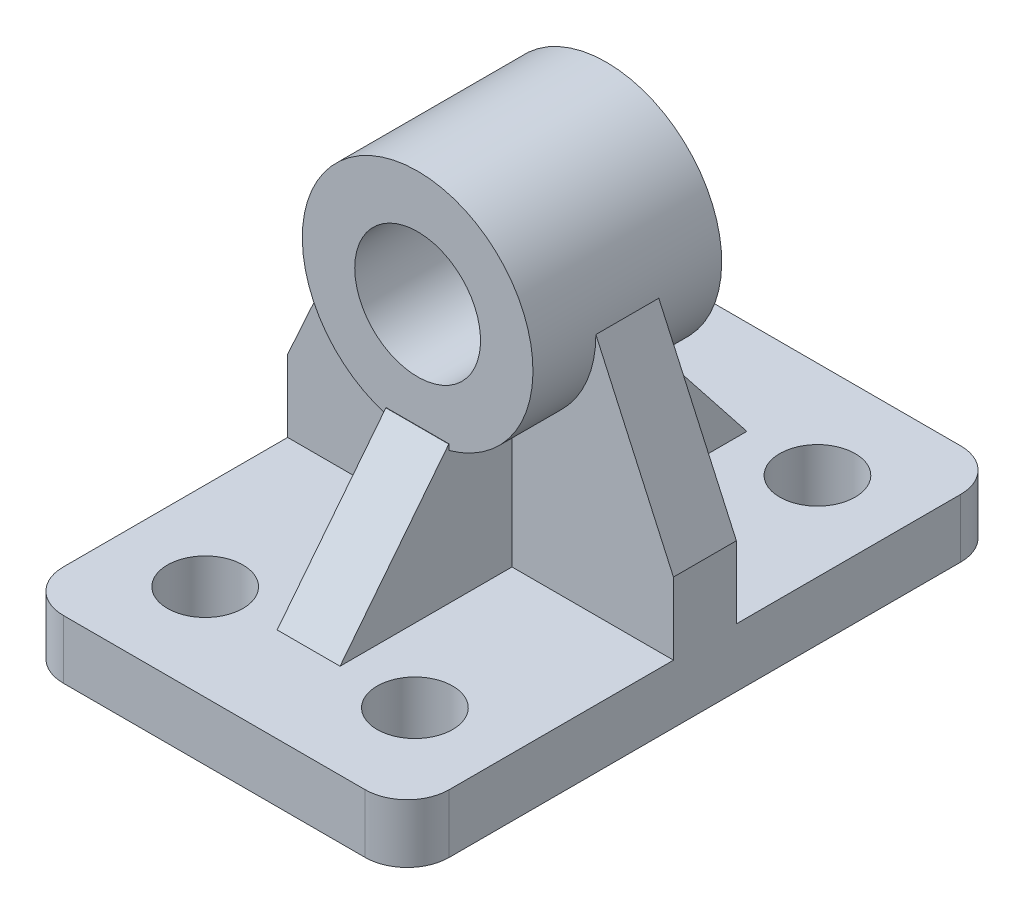
ISO-10303-21;
HEADER;
FILE_DESCRIPTION(('STEP AP214'),'2;1');
FILE_NAME('part.step','',(''),(''),'','','');
FILE_SCHEMA(('AUTOMOTIVE_DESIGN { 1 0 10303 214 1 1 1 1 }'));
ENDSEC;
DATA;
#1=APPLICATION_CONTEXT('core data for automotive mechanical design processes');
#2=APPLICATION_PROTOCOL_DEFINITION('international standard','automotive_design',2000,#1);
#3=PRODUCT_CONTEXT('',#1,'mechanical');
#4=PRODUCT('Part','Part','',(#3));
#5=PRODUCT_RELATED_PRODUCT_CATEGORY('part','',(#4));
#6=PRODUCT_DEFINITION_FORMATION('','',#4);
#7=PRODUCT_DEFINITION_CONTEXT('part definition',#1,'design');
#8=PRODUCT_DEFINITION('design','',#6,#7);
#9=PRODUCT_DEFINITION_SHAPE('','',#8);
#10=(LENGTH_UNIT() NAMED_UNIT(*) SI_UNIT(.MILLI.,.METRE.));
#11=(NAMED_UNIT(*) PLANE_ANGLE_UNIT() SI_UNIT($,.RADIAN.));
#12=(NAMED_UNIT(*) SI_UNIT($,.STERADIAN.) SOLID_ANGLE_UNIT());
#13=UNCERTAINTY_MEASURE_WITH_UNIT(LENGTH_MEASURE(1.E-05),#10,'distance_accuracy_value','');
#14=(GEOMETRIC_REPRESENTATION_CONTEXT(3) GLOBAL_UNCERTAINTY_ASSIGNED_CONTEXT((#13)) GLOBAL_UNIT_ASSIGNED_CONTEXT((#10,
#11,#12)) REPRESENTATION_CONTEXT('',''));
#15=CARTESIAN_POINT('',(0.,0.,0.));
#16=DIRECTION('',(0.,0.,1.));
#17=DIRECTION('',(1.,0.,0.));
#18=AXIS2_PLACEMENT_3D('',#15,#16,#17);
#19=CARTESIAN_POINT('',(0.,0.,-63.5));
#20=DIRECTION('',(0.,0.,1.));
#21=DIRECTION('',(1.,0.,0.));
#22=AXIS2_PLACEMENT_3D('',#19,#20,#21);
#23=PLANE('',#22);
#24=CARTESIAN_POINT('',(189.801246264602,58.,-63.5));
#25=DIRECTION('',(0.,0.,1.));
#26=DIRECTION('',(1.,0.,0.));
#27=AXIS2_PLACEMENT_3D('',#24,#25,#26);
#28=CIRCLE('',#27,27.5);
#29=CARTESIAN_POINT('',(197.301246264602,31.5424868893541,-63.5));
#30=VERTEX_POINT('',#29);
#31=CARTESIAN_POINT('',(217.301246264602,58.,-63.5));
#32=VERTEX_POINT('',#31);
#33=EDGE_CURVE('E289',#30,#32,#28,.T.);
#34=ORIENTED_EDGE('',*,*,#33,.F.);
#35=DIRECTION('',(0.,-1.,0.));
#36=VECTOR('',#35,1.);
#37=CARTESIAN_POINT('',(197.301246264602,0.,-63.5));
#38=LINE('',#37,#36);
#39=CARTESIAN_POINT('',(197.301246264602,0.,-63.5));
#40=VERTEX_POINT('',#39);
#41=EDGE_CURVE('E234',#30,#40,#38,.T.);
#42=ORIENTED_EDGE('',*,*,#41,.T.);
#43=DIRECTION('',(1.,0.,0.));
#44=VECTOR('',#43,1.);
#45=CARTESIAN_POINT('',(0.,0.,-63.5));
#46=LINE('',#45,#44);
#47=CARTESIAN_POINT('',(235.801246264602,0.,-63.5));
#48=VERTEX_POINT('',#47);
#49=EDGE_CURVE('E232',#40,#48,#46,.T.);
#50=ORIENTED_EDGE('',*,*,#49,.T.);
#51=DIRECTION('',(0.,1.,0.));
#52=VECTOR('',#51,1.);
#53=CARTESIAN_POINT('',(235.801246264602,0.,-63.5));
#54=LINE('',#53,#52);
#55=CARTESIAN_POINT('',(235.801246264602,17.1644901601247,-63.5));
#56=VERTEX_POINT('',#55);
#57=EDGE_CURVE('E298',#48,#56,#54,.T.);
#58=ORIENTED_EDGE('',*,*,#57,.T.);
#59=DIRECTION('',(-0.412663930755312,0.910883351617305,0.));
#60=VECTOR('',#59,1.);
#61=CARTESIAN_POINT('',(202.098231647013,91.5579920547202,-63.5));
#62=LINE('',#61,#60);
#63=EDGE_CURVE('E300',#56,#32,#62,.T.);
#64=ORIENTED_EDGE('',*,*,#63,.T.);
#65=EDGE_LOOP('',(#34,#42,#50,#58,#64));
#66=FACE_BOUND('',#65,.T.);
#67=ADVANCED_FACE('F41',(#66),#23,.T.);
#68=CARTESIAN_POINT('',(153.801246264602,0.,-132.));
#69=DIRECTION('',(0.,-1.,0.));
#70=DIRECTION('',(0.,0.,-1.));
#71=AXIS2_PLACEMENT_3D('',#68,#69,#70);
#72=PLANE('',#71);
#73=CARTESIAN_POINT('',(214.801246264602,0.,-118.829727622216));
#74=DIRECTION('',(0.,1.,0.));
#75=DIRECTION('',(0.,0.,1.));
#76=AXIS2_PLACEMENT_3D('',#73,#74,#75);
#77=CIRCLE('',#76,9.00000000000001);
#78=CARTESIAN_POINT('',(214.801246264602,0.,-109.829727622216));
#79=VERTEX_POINT('',#78);
#80=EDGE_CURVE('E335',#79,#79,#77,.T.);
#81=ORIENTED_EDGE('',*,*,#80,.F.);
#82=EDGE_LOOP('',(#81));
#83=FACE_BOUND('',#82,.T.);
#84=CARTESIAN_POINT('',(164.801246264602,0.,-118.829727622216));
#85=DIRECTION('',(0.,1.,0.));
#86=DIRECTION('',(0.,0.,1.));
#87=AXIS2_PLACEMENT_3D('',#84,#85,#86);
#88=CIRCLE('',#87,9.00000000000001);
#89=CARTESIAN_POINT('',(164.801246264602,0.,-109.829727622216));
#90=VERTEX_POINT('',#89);
#91=EDGE_CURVE('E331',#90,#90,#88,.T.);
#92=ORIENTED_EDGE('',*,*,#91,.F.);
#93=EDGE_LOOP('',(#92));
#94=FACE_BOUND('',#93,.T.);
#95=DIRECTION('',(0.,0.,1.));
#96=VECTOR('',#95,1.);
#97=CARTESIAN_POINT('',(182.301246264602,0.,-78.5));
#98=LINE('',#97,#96);
#99=CARTESIAN_POINT('',(182.301246264602,0.,-119.5));
#100=VERTEX_POINT('',#99);
#101=CARTESIAN_POINT('',(182.301246264602,0.,-78.5));
#102=VERTEX_POINT('',#101);
#103=EDGE_CURVE('E64',#100,#102,#98,.T.);
#104=ORIENTED_EDGE('',*,*,#103,.F.);
#105=DIRECTION('',(1.,0.,0.));
#106=VECTOR('',#105,1.);
#107=CARTESIAN_POINT('',(182.301246264602,0.,-119.5));
#108=LINE('',#107,#106);
#109=CARTESIAN_POINT('',(197.301246264602,0.,-119.5));
#110=VERTEX_POINT('',#109);
#111=EDGE_CURVE('E258',#100,#110,#108,.T.);
#112=ORIENTED_EDGE('',*,*,#111,.T.);
#113=DIRECTION('',(0.,0.,1.));
#114=VECTOR('',#113,1.);
#115=CARTESIAN_POINT('',(197.301246264602,0.,-119.5));
#116=LINE('',#115,#114);
#117=CARTESIAN_POINT('',(197.301246264602,0.,-78.5));
#118=VERTEX_POINT('',#117);
#119=EDGE_CURVE('E252',#110,#118,#116,.T.);
#120=ORIENTED_EDGE('',*,*,#119,.T.);
#121=DIRECTION('',(1.,0.,0.));
#122=VECTOR('',#121,1.);
#123=CARTESIAN_POINT('',(0.,0.,-78.5));
#124=LINE('',#123,#122);
#125=CARTESIAN_POINT('',(235.801246264602,0.,-78.5));
#126=VERTEX_POINT('',#125);
#127=EDGE_CURVE('E313',#118,#126,#124,.T.);
#128=ORIENTED_EDGE('',*,*,#127,.T.);
#129=DIRECTION('',(0.,0.,-1.));
#130=VECTOR('',#129,1.);
#131=CARTESIAN_POINT('',(235.801246264602,0.,-10.));
#132=LINE('',#131,#130);
#133=CARTESIAN_POINT('',(235.801246264602,0.,-132.));
#134=VERTEX_POINT('',#133);
#135=EDGE_CURVE('E396',#126,#134,#132,.T.);
#136=ORIENTED_EDGE('',*,*,#135,.T.);
#137=CARTESIAN_POINT('',(225.801246264602,0.,-132.));
#138=DIRECTION('',(0.,1.,0.));
#139=DIRECTION('',(0.,0.,-1.));
#140=AXIS2_PLACEMENT_3D('',#137,#138,#139);
#141=CIRCLE('',#140,10.);
#142=CARTESIAN_POINT('',(225.801246264602,0.,-142.));
#143=VERTEX_POINT('',#142);
#144=EDGE_CURVE('E399',#134,#143,#141,.T.);
#145=ORIENTED_EDGE('',*,*,#144,.T.);
#146=DIRECTION('',(-1.,0.,0.));
#147=VECTOR('',#146,1.);
#148=CARTESIAN_POINT('',(225.801246264602,0.,-142.));
#149=LINE('',#148,#147);
#150=CARTESIAN_POINT('',(153.801246264602,0.,-142.));
#151=VERTEX_POINT('',#150);
#152=EDGE_CURVE('E360',#143,#151,#149,.T.);
#153=ORIENTED_EDGE('',*,*,#152,.T.);
#154=CARTESIAN_POINT('',(153.801246264602,0.,-132.));
#155=DIRECTION('',(0.,1.,0.));
#156=DIRECTION('',(0.,0.,-1.));
#157=AXIS2_PLACEMENT_3D('',#154,#155,#156);
#158=CIRCLE('',#157,9.99999999999999);
#159=CARTESIAN_POINT('',(143.801246264602,0.,-132.));
#160=VERTEX_POINT('',#159);
#161=EDGE_CURVE('E353',#151,#160,#158,.T.);
#162=ORIENTED_EDGE('',*,*,#161,.T.);
#163=DIRECTION('',(0.,0.,1.));
#164=VECTOR('',#163,1.);
#165=CARTESIAN_POINT('',(143.801246264602,0.,-132.));
#166=LINE('',#165,#164);
#167=CARTESIAN_POINT('',(143.801246264602,0.,-78.5));
#168=VERTEX_POINT('',#167);
#169=EDGE_CURVE('E385',#160,#168,#166,.T.);
#170=ORIENTED_EDGE('',*,*,#169,.T.);
#171=EDGE_CURVE('E314',#168,#102,#124,.T.);
#172=ORIENTED_EDGE('',*,*,#171,.T.);
#173=EDGE_LOOP('',(#104,#112,#120,#128,#136,#145,#153,#162,#170,#172));
#174=FACE_BOUND('',#173,.T.);
#175=ADVANCED_FACE('F497',(#83,#94,#174),#72,.F.);
#176=CARTESIAN_POINT('',(0.,0.,-78.5));
#177=DIRECTION('',(0.,0.,1.));
#178=DIRECTION('',(1.,0.,0.));
#179=AXIS2_PLACEMENT_3D('',#176,#177,#178);
#180=PLANE('',#179);
#181=DIRECTION('',(0.,1.,0.));
#182=VECTOR('',#181,1.);
#183=CARTESIAN_POINT('',(182.301246264602,0.,-78.5));
#184=LINE('',#183,#182);
#185=CARTESIAN_POINT('',(182.301246264602,31.5424868893541,-78.5));
#186=VERTEX_POINT('',#185);
#187=EDGE_CURVE('E270',#102,#186,#184,.T.);
#188=ORIENTED_EDGE('',*,*,#187,.F.);
#189=ORIENTED_EDGE('',*,*,#171,.F.);
#190=DIRECTION('',(0.,1.,0.));
#191=VECTOR('',#190,1.);
#192=CARTESIAN_POINT('',(143.801246264602,0.,-78.5));
#193=LINE('',#192,#191);
#194=CARTESIAN_POINT('',(143.801246264602,17.1644901601247,-78.5));
#195=VERTEX_POINT('',#194);
#196=EDGE_CURVE('E310',#168,#195,#193,.T.);
#197=ORIENTED_EDGE('',*,*,#196,.T.);
#198=DIRECTION('',(0.412663930755312,0.910883351617305,0.));
#199=VECTOR('',#198,1.);
#200=CARTESIAN_POINT('',(112.861175529862,-51.1302970255465,-78.5));
#201=LINE('',#200,#199);
#202=CARTESIAN_POINT('',(162.301246264602,58.,-78.5));
#203=VERTEX_POINT('',#202);
#204=EDGE_CURVE('E307',#195,#203,#201,.T.);
#205=ORIENTED_EDGE('',*,*,#204,.T.);
#206=CARTESIAN_POINT('',(189.801246264602,58.,-78.5));
#207=DIRECTION('',(0.,0.,1.));
#208=DIRECTION('',(1.,0.,0.));
#209=AXIS2_PLACEMENT_3D('',#206,#207,#208);
#210=CIRCLE('',#209,27.5);
#211=EDGE_CURVE('E304',#203,#186,#210,.T.);
#212=ORIENTED_EDGE('',*,*,#211,.T.);
#213=EDGE_LOOP('',(#188,#189,#197,#205,#212));
#214=FACE_BOUND('',#213,.T.);
#215=ADVANCED_FACE('F495',(#214),#180,.F.);
#216=CARTESIAN_POINT('',(189.801246264602,58.,-48.5));
#217=DIRECTION('',(0.,0.,-1.));
#218=DIRECTION('',(-1.,0.,0.));
#219=AXIS2_PLACEMENT_3D('',#216,#217,#218);
#220=CYLINDRICAL_SURFACE('',#219,27.5);
#221=CARTESIAN_POINT('',(162.301246264602,58.,-63.5));
#222=VERTEX_POINT('',#221);
#223=CARTESIAN_POINT('',(182.301246264602,31.5424868893541,-63.5));
#224=VERTEX_POINT('',#223);
#225=EDGE_CURVE('E285',#222,#224,#28,.T.);
#226=ORIENTED_EDGE('',*,*,#225,.T.);
#227=DIRECTION('',(0.,0.,-1.));
#228=VECTOR('',#227,1.);
#229=CARTESIAN_POINT('',(182.301246264602,31.5424868893541,-48.5));
#230=LINE('',#229,#228);
#231=CARTESIAN_POINT('',(182.301246264602,31.5424868893541,-48.5));
#232=VERTEX_POINT('',#231);
#233=EDGE_CURVE('E243',#224,#232,#230,.F.);
#234=ORIENTED_EDGE('',*,*,#233,.T.);
#235=CARTESIAN_POINT('',(189.801246264602,58.,-48.5));
#236=DIRECTION('',(0.,0.,1.));
#237=DIRECTION('',(1.,0.,0.));
#238=AXIS2_PLACEMENT_3D('',#235,#236,#237);
#239=CIRCLE('',#238,27.5);
#240=CARTESIAN_POINT('',(197.301246264602,31.5424868893541,-48.5));
#241=VERTEX_POINT('',#240);
#242=EDGE_CURVE('E281',#241,#232,#239,.T.);
#243=ORIENTED_EDGE('',*,*,#242,.F.);
#244=DIRECTION('',(0.,0.,-1.));
#245=VECTOR('',#244,1.);
#246=CARTESIAN_POINT('',(197.301246264602,31.5424868893541,-48.5));
#247=LINE('',#246,#245);
#248=EDGE_CURVE('E56',#30,#241,#247,.F.);
#249=ORIENTED_EDGE('',*,*,#248,.F.);
#250=ORIENTED_EDGE('',*,*,#33,.T.);
#251=DIRECTION('',(0.,0.,-1.));
#252=VECTOR('',#251,1.);
#253=CARTESIAN_POINT('',(217.301246264602,58.,-63.5));
#254=LINE('',#253,#252);
#255=CARTESIAN_POINT('',(217.301246264602,58.,-78.5));
#256=VERTEX_POINT('',#255);
#257=EDGE_CURVE('E303',#32,#256,#254,.T.);
#258=ORIENTED_EDGE('',*,*,#257,.T.);
#259=CARTESIAN_POINT('',(197.301246264602,31.5424868893541,-78.5));
#260=VERTEX_POINT('',#259);
#261=EDGE_CURVE('E284',#260,#256,#210,.T.);
#262=ORIENTED_EDGE('',*,*,#261,.F.);
#263=DIRECTION('',(0.,0.,-1.));
#264=VECTOR('',#263,1.);
#265=CARTESIAN_POINT('',(197.301246264602,31.5424868893541,-48.5));
#266=LINE('',#265,#264);
#267=CARTESIAN_POINT('',(197.301246264602,31.5424868893541,-93.5));
#268=VERTEX_POINT('',#267);
#269=EDGE_CURVE('E260',#260,#268,#266,.T.);
#270=ORIENTED_EDGE('',*,*,#269,.T.);
#271=CARTESIAN_POINT('',(189.801246264602,58.,-93.5));
#272=DIRECTION('',(0.,0.,-1.));
#273=DIRECTION('',(-1.,0.,0.));
#274=AXIS2_PLACEMENT_3D('',#271,#272,#273);
#275=CIRCLE('',#274,27.5);
#276=CARTESIAN_POINT('',(182.301246264602,31.5424868893541,-93.5));
#277=VERTEX_POINT('',#276);
#278=EDGE_CURVE('E276',#277,#268,#275,.T.);
#279=ORIENTED_EDGE('',*,*,#278,.F.);
#280=DIRECTION('',(0.,0.,-1.));
#281=VECTOR('',#280,1.);
#282=CARTESIAN_POINT('',(182.301246264602,31.5424868893541,-48.5));
#283=LINE('',#282,#281);
#284=EDGE_CURVE('E267',#186,#277,#283,.T.);
#285=ORIENTED_EDGE('',*,*,#284,.F.);
#286=ORIENTED_EDGE('',*,*,#211,.F.);
#287=DIRECTION('',(0.,0.,-1.));
#288=VECTOR('',#287,1.);
#289=CARTESIAN_POINT('',(162.301246264602,58.,-63.5));
#290=LINE('',#289,#288);
#291=EDGE_CURVE('E328',#222,#203,#290,.T.);
#292=ORIENTED_EDGE('',*,*,#291,.F.);
#293=EDGE_LOOP('',(#226,#234,#243,#249,#250,#258,#262,#270,#279,#285,#286,#292));
#294=FACE_BOUND('',#293,.T.);
#295=ADVANCED_FACE('F439',(#294),#220,.T.);
#296=CARTESIAN_POINT('',(189.801246264602,58.,-93.5));
#297=DIRECTION('',(0.,0.,-1.));
#298=DIRECTION('',(-1.,0.,0.));
#299=AXIS2_PLACEMENT_3D('',#296,#297,#298);
#300=PLANE('',#299);
#301=CARTESIAN_POINT('',(189.801246264602,58.,-93.5));
#302=DIRECTION('',(0.,0.,-1.));
#303=DIRECTION('',(-1.,0.,0.));
#304=AXIS2_PLACEMENT_3D('',#301,#302,#303);
#305=CIRCLE('',#304,15.);
#306=CARTESIAN_POINT('',(174.801246264602,58.,-93.5));
#307=VERTEX_POINT('',#306);
#308=EDGE_CURVE('E273',#307,#307,#305,.T.);
#309=ORIENTED_EDGE('',*,*,#308,.F.);
#310=EDGE_LOOP('',(#309));
#311=FACE_BOUND('',#310,.T.);
#312=DIRECTION('',(1.,0.,0.));
#313=VECTOR('',#312,1.);
#314=CARTESIAN_POINT('',(182.301246264602,32.9050889007348,-93.5));
#315=LINE('',#314,#313);
#316=CARTESIAN_POINT('',(182.301246264602,32.9050889007348,-93.5));
#317=VERTEX_POINT('',#316);
#318=CARTESIAN_POINT('',(197.301246264602,32.9050889007348,-93.5));
#319=VERTEX_POINT('',#318);
#320=EDGE_CURVE('E254',#317,#319,#315,.T.);
#321=ORIENTED_EDGE('',*,*,#320,.F.);
#322=DIRECTION('',(0.,-1.,0.));
#323=VECTOR('',#322,1.);
#324=CARTESIAN_POINT('',(182.301246264602,58.,-93.5));
#325=LINE('',#324,#323);
#326=EDGE_CURVE('E424',#317,#277,#325,.T.);
#327=ORIENTED_EDGE('',*,*,#326,.T.);
#328=ORIENTED_EDGE('',*,*,#278,.T.);
#329=DIRECTION('',(0.,-1.,0.));
#330=VECTOR('',#329,1.);
#331=CARTESIAN_POINT('',(197.301246264602,58.,-93.5));
#332=LINE('',#331,#330);
#333=EDGE_CURVE('E406',#319,#268,#332,.T.);
#334=ORIENTED_EDGE('',*,*,#333,.F.);
#335=EDGE_LOOP('',(#321,#327,#328,#334));
#336=FACE_BOUND('',#335,.T.);
#337=ADVANCED_FACE('F535',(#311,#336),#300,.T.);
#338=CARTESIAN_POINT('',(164.801246264602,0.,-22.8450203924491));
#339=DIRECTION('',(0.,1.,0.));
#340=DIRECTION('',(0.,0.,1.));
#341=AXIS2_PLACEMENT_3D('',#338,#339,#340);
#342=CIRCLE('',#341,9.00000000000001);
#343=CARTESIAN_POINT('',(164.801246264602,0.,-13.8450203924491));
#344=VERTEX_POINT('',#343);
#345=EDGE_CURVE('E347',#344,#344,#342,.T.);
#346=ORIENTED_EDGE('',*,*,#345,.F.);
#347=EDGE_LOOP('',(#346));
#348=FACE_BOUND('',#347,.T.);
#349=CARTESIAN_POINT('',(214.801246264602,0.,-22.8450203924491));
#350=DIRECTION('',(0.,1.,0.));
#351=DIRECTION('',(0.,0.,1.));
#352=AXIS2_PLACEMENT_3D('',#349,#350,#351);
#353=CIRCLE('',#352,9.00000000000001);
#354=CARTESIAN_POINT('',(214.801246264602,0.,-13.8450203924491));
#355=VERTEX_POINT('',#354);
#356=EDGE_CURVE('E341',#355,#355,#353,.T.);
#357=ORIENTED_EDGE('',*,*,#356,.F.);
#358=EDGE_LOOP('',(#357));
#359=FACE_BOUND('',#358,.T.);
#360=DIRECTION('',(1.,0.,0.));
#361=VECTOR('',#360,1.);
#362=CARTESIAN_POINT('',(182.301246264602,0.,-22.5));
#363=LINE('',#362,#361);
#364=CARTESIAN_POINT('',(182.301246264602,0.,-22.5));
#365=VERTEX_POINT('',#364);
#366=CARTESIAN_POINT('',(197.301246264602,0.,-22.5));
#367=VERTEX_POINT('',#366);
#368=EDGE_CURVE('E209',#365,#367,#363,.T.);
#369=ORIENTED_EDGE('',*,*,#368,.F.);
#370=DIRECTION('',(0.,0.,-1.));
#371=VECTOR('',#370,1.);
#372=CARTESIAN_POINT('',(182.301246264602,0.,-22.5));
#373=LINE('',#372,#371);
#374=CARTESIAN_POINT('',(182.301246264602,0.,-63.5));
#375=VERTEX_POINT('',#374);
#376=EDGE_CURVE('E227',#365,#375,#373,.T.);
#377=ORIENTED_EDGE('',*,*,#376,.T.);
#378=CARTESIAN_POINT('',(143.801246264602,0.,-63.5));
#379=VERTEX_POINT('',#378);
#380=EDGE_CURVE('E295',#379,#375,#46,.T.);
#381=ORIENTED_EDGE('',*,*,#380,.F.);
#382=CARTESIAN_POINT('',(143.801246264602,0.,-10.));
#383=VERTEX_POINT('',#382);
#384=EDGE_CURVE('E384',#379,#383,#166,.T.);
#385=ORIENTED_EDGE('',*,*,#384,.T.);
#386=CARTESIAN_POINT('',(153.801246264602,0.,-10.));
#387=DIRECTION('',(0.,1.,0.));
#388=DIRECTION('',(0.,0.,-1.));
#389=AXIS2_PLACEMENT_3D('',#386,#387,#388);
#390=CIRCLE('',#389,10.);
#391=CARTESIAN_POINT('',(153.801246264602,0.,0.));
#392=VERTEX_POINT('',#391);
#393=EDGE_CURVE('E387',#383,#392,#390,.T.);
#394=ORIENTED_EDGE('',*,*,#393,.T.);
#395=DIRECTION('',(1.,0.,0.));
#396=VECTOR('',#395,1.);
#397=CARTESIAN_POINT('',(153.801246264602,0.,0.));
#398=LINE('',#397,#396);
#399=CARTESIAN_POINT('',(225.801246264602,0.,0.));
#400=VERTEX_POINT('',#399);
#401=EDGE_CURVE('E390',#392,#400,#398,.T.);
#402=ORIENTED_EDGE('',*,*,#401,.T.);
#403=CARTESIAN_POINT('',(225.801246264602,0.,-10.));
#404=DIRECTION('',(0.,1.,0.));
#405=DIRECTION('',(0.,0.,-1.));
#406=AXIS2_PLACEMENT_3D('',#403,#404,#405);
#407=CIRCLE('',#406,10.);
#408=CARTESIAN_POINT('',(235.801246264602,0.,-10.));
#409=VERTEX_POINT('',#408);
#410=EDGE_CURVE('E393',#400,#409,#407,.T.);
#411=ORIENTED_EDGE('',*,*,#410,.T.);
#412=EDGE_CURVE('E397',#409,#48,#132,.T.);
#413=ORIENTED_EDGE('',*,*,#412,.T.);
#414=ORIENTED_EDGE('',*,*,#49,.F.);
#415=DIRECTION('',(0.,0.,1.));
#416=VECTOR('',#415,1.);
#417=CARTESIAN_POINT('',(197.301246264602,0.,-65.3950820099108));
#418=LINE('',#417,#416);
#419=EDGE_CURVE('E222',#40,#367,#418,.T.);
#420=ORIENTED_EDGE('',*,*,#419,.T.);
#421=EDGE_LOOP('',(#369,#377,#381,#385,#394,#402,#411,#413,#414,#420));
#422=FACE_BOUND('',#421,.T.);
#423=ADVANCED_FACE('F230',(#348,#359,#422),#72,.F.);
#424=CARTESIAN_POINT('',(153.801246264602,-14.,-132.));
#425=DIRECTION('',(0.,1.,0.));
#426=DIRECTION('',(0.,0.,1.));
#427=AXIS2_PLACEMENT_3D('',#424,#425,#426);
#428=CYLINDRICAL_SURFACE('',#427,9.99999999999999);
#429=ORIENTED_EDGE('',*,*,#161,.F.);
#430=DIRECTION('',(0.,1.,0.));
#431=VECTOR('',#430,1.);
#432=CARTESIAN_POINT('',(153.801246264602,-14.,-142.));
#433=LINE('',#432,#431);
#434=CARTESIAN_POINT('',(153.801246264602,-14.,-142.));
#435=VERTEX_POINT('',#434);
#436=EDGE_CURVE('E404',#435,#151,#433,.T.);
#437=ORIENTED_EDGE('',*,*,#436,.F.);
#438=CARTESIAN_POINT('',(153.801246264602,-14.,-132.));
#439=DIRECTION('',(0.,1.,0.));
#440=DIRECTION('',(0.,0.,-1.));
#441=AXIS2_PLACEMENT_3D('',#438,#439,#440);
#442=CIRCLE('',#441,9.99999999999999);
#443=CARTESIAN_POINT('',(143.801246264602,-14.,-132.));
#444=VERTEX_POINT('',#443);
#445=EDGE_CURVE('E356',#435,#444,#442,.T.);
#446=ORIENTED_EDGE('',*,*,#445,.T.);
#447=DIRECTION('',(0.,1.,0.));
#448=VECTOR('',#447,1.);
#449=CARTESIAN_POINT('',(143.801246264602,-14.,-132.));
#450=LINE('',#449,#448);
#451=EDGE_CURVE('E381',#444,#160,#450,.T.);
#452=ORIENTED_EDGE('',*,*,#451,.T.);
#453=EDGE_LOOP('',(#429,#437,#446,#452));
#454=FACE_BOUND('',#453,.T.);
#455=ADVANCED_FACE('F43',(#454),#428,.T.);
#456=CARTESIAN_POINT('',(225.801246264602,-14.,-142.));
#457=DIRECTION('',(0.,0.,-1.));
#458=DIRECTION('',(-1.,0.,0.));
#459=AXIS2_PLACEMENT_3D('',#456,#457,#458);
#460=PLANE('',#459);
#461=ORIENTED_EDGE('',*,*,#152,.F.);
#462=DIRECTION('',(0.,1.,0.));
#463=VECTOR('',#462,1.);
#464=CARTESIAN_POINT('',(225.801246264602,-14.,-142.));
#465=LINE('',#464,#463);
#466=CARTESIAN_POINT('',(225.801246264602,-14.,-142.));
#467=VERTEX_POINT('',#466);
#468=EDGE_CURVE('E407',#467,#143,#465,.T.);
#469=ORIENTED_EDGE('',*,*,#468,.F.);
#470=DIRECTION('',(-1.,0.,0.));
#471=VECTOR('',#470,1.);
#472=CARTESIAN_POINT('',(225.801246264602,-14.,-142.));
#473=LINE('',#472,#471);
#474=EDGE_CURVE('E378',#467,#435,#473,.T.);
#475=ORIENTED_EDGE('',*,*,#474,.T.);
#476=ORIENTED_EDGE('',*,*,#436,.T.);
#477=EDGE_LOOP('',(#461,#469,#475,#476));
#478=FACE_BOUND('',#477,.T.);
#479=ADVANCED_FACE('F837',(#478),#460,.T.);
#480=CARTESIAN_POINT('',(225.801246264602,-14.,-132.));
#481=DIRECTION('',(0.,1.,0.));
#482=DIRECTION('',(0.,0.,1.));
#483=AXIS2_PLACEMENT_3D('',#480,#481,#482);
#484=CYLINDRICAL_SURFACE('',#483,10.);
#485=ORIENTED_EDGE('',*,*,#144,.F.);
#486=DIRECTION('',(0.,1.,0.));
#487=VECTOR('',#486,1.);
#488=CARTESIAN_POINT('',(235.801246264602,-14.,-132.));
#489=LINE('',#488,#487);
#490=CARTESIAN_POINT('',(235.801246264602,-14.,-132.));
#491=VERTEX_POINT('',#490);
#492=EDGE_CURVE('E409',#491,#134,#489,.T.);
#493=ORIENTED_EDGE('',*,*,#492,.F.);
#494=CARTESIAN_POINT('',(225.801246264602,-14.,-132.));
#495=DIRECTION('',(0.,1.,0.));
#496=DIRECTION('',(0.,0.,-1.));
#497=AXIS2_PLACEMENT_3D('',#494,#495,#496);
#498=CIRCLE('',#497,10.);
#499=EDGE_CURVE('E375',#491,#467,#498,.T.);
#500=ORIENTED_EDGE('',*,*,#499,.T.);
#501=ORIENTED_EDGE('',*,*,#468,.T.);
#502=EDGE_LOOP('',(#485,#493,#500,#501));
#503=FACE_BOUND('',#502,.T.);
#504=ADVANCED_FACE('F778',(#503),#484,.T.);
#505=CARTESIAN_POINT('',(235.801246264602,-14.,-10.));
#506=DIRECTION('',(1.,0.,0.));
#507=DIRECTION('',(0.,0.,-1.));
#508=AXIS2_PLACEMENT_3D('',#505,#506,#507);
#509=PLANE('',#508);
#510=ORIENTED_EDGE('',*,*,#412,.F.);
#511=DIRECTION('',(0.,1.,0.));
#512=VECTOR('',#511,1.);
#513=CARTESIAN_POINT('',(235.801246264602,-14.,-10.));
#514=LINE('',#513,#512);
#515=CARTESIAN_POINT('',(235.801246264602,-14.,-10.));
#516=VERTEX_POINT('',#515);
#517=EDGE_CURVE('E412',#516,#409,#514,.T.);
#518=ORIENTED_EDGE('',*,*,#517,.F.);
#519=DIRECTION('',(0.,0.,-1.));
#520=VECTOR('',#519,1.);
#521=CARTESIAN_POINT('',(235.801246264602,-14.,-10.));
#522=LINE('',#521,#520);
#523=EDGE_CURVE('E372',#516,#491,#522,.T.);
#524=ORIENTED_EDGE('',*,*,#523,.T.);
#525=ORIENTED_EDGE('',*,*,#492,.T.);
#526=ORIENTED_EDGE('',*,*,#135,.F.);
#527=DIRECTION('',(0.,1.,0.));
#528=VECTOR('',#527,1.);
#529=CARTESIAN_POINT('',(235.801246264602,0.,-78.5));
#530=LINE('',#529,#528);
#531=CARTESIAN_POINT('',(235.801246264602,17.1644901601247,-78.5));
#532=VERTEX_POINT('',#531);
#533=EDGE_CURVE('E316',#126,#532,#530,.T.);
#534=ORIENTED_EDGE('',*,*,#533,.T.);
#535=DIRECTION('',(0.,0.,-1.));
#536=VECTOR('',#535,1.);
#537=CARTESIAN_POINT('',(235.801246264602,17.1644901601247,-63.5));
#538=LINE('',#537,#536);
#539=EDGE_CURVE('E323',#56,#532,#538,.T.);
#540=ORIENTED_EDGE('',*,*,#539,.F.);
#541=ORIENTED_EDGE('',*,*,#57,.F.);
#542=EDGE_LOOP('',(#510,#518,#524,#525,#526,#534,#540,#541));
#543=FACE_BOUND('',#542,.T.);
#544=ADVANCED_FACE('F468',(#543),#509,.T.);
#545=CARTESIAN_POINT('',(225.801246264602,-14.,-10.));
#546=DIRECTION('',(0.,1.,0.));
#547=DIRECTION('',(0.,0.,1.));
#548=AXIS2_PLACEMENT_3D('',#545,#546,#547);
#549=CYLINDRICAL_SURFACE('',#548,10.);
#550=ORIENTED_EDGE('',*,*,#410,.F.);
#551=DIRECTION('',(0.,1.,0.));
#552=VECTOR('',#551,1.);
#553=CARTESIAN_POINT('',(225.801246264602,-14.,0.));
#554=LINE('',#553,#552);
#555=CARTESIAN_POINT('',(225.801246264602,-14.,0.));
#556=VERTEX_POINT('',#555);
#557=EDGE_CURVE('E414',#556,#400,#554,.T.);
#558=ORIENTED_EDGE('',*,*,#557,.F.);
#559=CARTESIAN_POINT('',(225.801246264602,-14.,-10.));
#560=DIRECTION('',(0.,1.,0.));
#561=DIRECTION('',(0.,0.,-1.));
#562=AXIS2_PLACEMENT_3D('',#559,#560,#561);
#563=CIRCLE('',#562,10.);
#564=EDGE_CURVE('E369',#556,#516,#563,.T.);
#565=ORIENTED_EDGE('',*,*,#564,.T.);
#566=ORIENTED_EDGE('',*,*,#517,.T.);
#567=EDGE_LOOP('',(#550,#558,#565,#566));
#568=FACE_BOUND('',#567,.T.);
#569=ADVANCED_FACE('F463',(#568),#549,.T.);
#570=CARTESIAN_POINT('',(153.801246264602,-14.,0.));
#571=DIRECTION('',(0.,0.,1.));
#572=DIRECTION('',(1.,0.,0.));
#573=AXIS2_PLACEMENT_3D('',#570,#571,#572);
#574=PLANE('',#573);
#575=ORIENTED_EDGE('',*,*,#401,.F.);
#576=DIRECTION('',(0.,1.,0.));
#577=VECTOR('',#576,1.);
#578=CARTESIAN_POINT('',(153.801246264602,-14.,0.));
#579=LINE('',#578,#577);
#580=CARTESIAN_POINT('',(153.801246264602,-14.,0.));
#581=VERTEX_POINT('',#580);
#582=EDGE_CURVE('E416',#581,#392,#579,.T.);
#583=ORIENTED_EDGE('',*,*,#582,.F.);
#584=DIRECTION('',(1.,0.,0.));
#585=VECTOR('',#584,1.);
#586=CARTESIAN_POINT('',(153.801246264602,-14.,0.));
#587=LINE('',#586,#585);
#588=EDGE_CURVE('E366',#581,#556,#587,.T.);
#589=ORIENTED_EDGE('',*,*,#588,.T.);
#590=ORIENTED_EDGE('',*,*,#557,.T.);
#591=EDGE_LOOP('',(#575,#583,#589,#590));
#592=FACE_BOUND('',#591,.T.);
#593=ADVANCED_FACE('F459',(#592),#574,.T.);
#594=CARTESIAN_POINT('',(153.801246264602,-14.,-10.));
#595=DIRECTION('',(0.,1.,0.));
#596=DIRECTION('',(0.,0.,1.));
#597=AXIS2_PLACEMENT_3D('',#594,#595,#596);
#598=CYLINDRICAL_SURFACE('',#597,10.);
#599=ORIENTED_EDGE('',*,*,#393,.F.);
#600=DIRECTION('',(0.,1.,0.));
#601=VECTOR('',#600,1.);
#602=CARTESIAN_POINT('',(143.801246264602,-14.,-10.));
#603=LINE('',#602,#601);
#604=CARTESIAN_POINT('',(143.801246264602,-14.,-10.));
#605=VERTEX_POINT('',#604);
#606=EDGE_CURVE('E418',#605,#383,#603,.T.);
#607=ORIENTED_EDGE('',*,*,#606,.F.);
#608=CARTESIAN_POINT('',(153.801246264602,-14.,-10.));
#609=DIRECTION('',(0.,1.,0.));
#610=DIRECTION('',(0.,0.,-1.));
#611=AXIS2_PLACEMENT_3D('',#608,#609,#610);
#612=CIRCLE('',#611,10.);
#613=EDGE_CURVE('E363',#605,#581,#612,.T.);
#614=ORIENTED_EDGE('',*,*,#613,.T.);
#615=ORIENTED_EDGE('',*,*,#582,.T.);
#616=EDGE_LOOP('',(#599,#607,#614,#615));
#617=FACE_BOUND('',#616,.T.);
#618=ADVANCED_FACE('F455',(#617),#598,.T.);
#619=CARTESIAN_POINT('',(143.801246264602,-14.,-132.));
#620=DIRECTION('',(-1.,0.,0.));
#621=DIRECTION('',(0.,0.,1.));
#622=AXIS2_PLACEMENT_3D('',#619,#620,#621);
#623=PLANE('',#622);
#624=ORIENTED_EDGE('',*,*,#169,.F.);
#625=ORIENTED_EDGE('',*,*,#451,.F.);
#626=DIRECTION('',(0.,0.,1.));
#627=VECTOR('',#626,1.);
#628=CARTESIAN_POINT('',(143.801246264602,-14.,-132.));
#629=LINE('',#628,#627);
#630=EDGE_CURVE('E359',#444,#605,#629,.T.);
#631=ORIENTED_EDGE('',*,*,#630,.T.);
#632=ORIENTED_EDGE('',*,*,#606,.T.);
#633=ORIENTED_EDGE('',*,*,#384,.F.);
#634=DIRECTION('',(0.,1.,0.));
#635=VECTOR('',#634,1.);
#636=CARTESIAN_POINT('',(143.801246264602,0.,-63.5));
#637=LINE('',#636,#635);
#638=CARTESIAN_POINT('',(143.801246264602,17.1644901601247,-63.5));
#639=VERTEX_POINT('',#638);
#640=EDGE_CURVE('E292',#379,#639,#637,.T.);
#641=ORIENTED_EDGE('',*,*,#640,.T.);
#642=DIRECTION('',(0.,0.,-1.));
#643=VECTOR('',#642,1.);
#644=CARTESIAN_POINT('',(143.801246264602,17.1644901601247,-63.5));
#645=LINE('',#644,#643);
#646=EDGE_CURVE('E326',#639,#195,#645,.T.);
#647=ORIENTED_EDGE('',*,*,#646,.T.);
#648=ORIENTED_EDGE('',*,*,#196,.F.);
#649=EDGE_LOOP('',(#624,#625,#631,#632,#633,#641,#647,#648));
#650=FACE_BOUND('',#649,.T.);
#651=ADVANCED_FACE('F450',(#650),#623,.T.);
#652=CARTESIAN_POINT('',(153.801246264602,-14.,-132.));
#653=DIRECTION('',(0.,-1.,0.));
#654=DIRECTION('',(0.,0.,-1.));
#655=AXIS2_PLACEMENT_3D('',#652,#653,#654);
#656=PLANE('',#655);
#657=CARTESIAN_POINT('',(164.801246264602,-14.,-118.829727622216));
#658=DIRECTION('',(0.,1.,0.));
#659=DIRECTION('',(0.,0.,1.));
#660=AXIS2_PLACEMENT_3D('',#657,#658,#659);
#661=CIRCLE('',#660,9.00000000000001);
#662=CARTESIAN_POINT('',(164.801246264602,-14.,-109.829727622216));
#663=VERTEX_POINT('',#662);
#664=EDGE_CURVE('E332',#663,#663,#661,.T.);
#665=ORIENTED_EDGE('',*,*,#664,.T.);
#666=EDGE_LOOP('',(#665));
#667=FACE_BOUND('',#666,.T.);
#668=CARTESIAN_POINT('',(214.801246264602,-14.,-118.829727622216));
#669=DIRECTION('',(0.,1.,0.));
#670=DIRECTION('',(0.,0.,1.));
#671=AXIS2_PLACEMENT_3D('',#668,#669,#670);
#672=CIRCLE('',#671,9.00000000000001);
#673=CARTESIAN_POINT('',(214.801246264602,-14.,-109.829727622216));
#674=VERTEX_POINT('',#673);
#675=EDGE_CURVE('E338',#674,#674,#672,.T.);
#676=ORIENTED_EDGE('',*,*,#675,.T.);
#677=EDGE_LOOP('',(#676));
#678=FACE_BOUND('',#677,.T.);
#679=CARTESIAN_POINT('',(214.801246264602,-14.,-22.8450203924491));
#680=DIRECTION('',(0.,1.,0.));
#681=DIRECTION('',(0.,0.,1.));
#682=AXIS2_PLACEMENT_3D('',#679,#680,#681);
#683=CIRCLE('',#682,9.00000000000001);
#684=CARTESIAN_POINT('',(214.801246264602,-14.,-13.8450203924491));
#685=VERTEX_POINT('',#684);
#686=EDGE_CURVE('E344',#685,#685,#683,.T.);
#687=ORIENTED_EDGE('',*,*,#686,.T.);
#688=EDGE_LOOP('',(#687));
#689=FACE_BOUND('',#688,.T.);
#690=CARTESIAN_POINT('',(164.801246264602,-14.,-22.8450203924491));
#691=DIRECTION('',(0.,1.,0.));
#692=DIRECTION('',(0.,0.,1.));
#693=AXIS2_PLACEMENT_3D('',#690,#691,#692);
#694=CIRCLE('',#693,9.00000000000001);
#695=CARTESIAN_POINT('',(164.801246264602,-14.,-13.8450203924491));
#696=VERTEX_POINT('',#695);
#697=EDGE_CURVE('E350',#696,#696,#694,.T.);
#698=ORIENTED_EDGE('',*,*,#697,.T.);
#699=EDGE_LOOP('',(#698));
#700=FACE_BOUND('',#699,.T.);
#701=ORIENTED_EDGE('',*,*,#445,.F.);
#702=ORIENTED_EDGE('',*,*,#474,.F.);
#703=ORIENTED_EDGE('',*,*,#499,.F.);
#704=ORIENTED_EDGE('',*,*,#523,.F.);
#705=ORIENTED_EDGE('',*,*,#564,.F.);
#706=ORIENTED_EDGE('',*,*,#588,.F.);
#707=ORIENTED_EDGE('',*,*,#613,.F.);
#708=ORIENTED_EDGE('',*,*,#630,.F.);
#709=EDGE_LOOP('',(#701,#702,#703,#704,#705,#706,#707,#708));
#710=FACE_BOUND('',#709,.T.);
#711=ADVANCED_FACE('F710',(#667,#678,#689,#700,#710),#656,.T.);
#712=CARTESIAN_POINT('',(164.801246264602,-14.,-22.8450203924491));
#713=DIRECTION('',(0.,1.,0.));
#714=DIRECTION('',(0.,0.,1.));
#715=AXIS2_PLACEMENT_3D('',#712,#713,#714);
#716=CYLINDRICAL_SURFACE('',#715,9.00000000000001);
#717=ORIENTED_EDGE('',*,*,#697,.F.);
#718=EDGE_LOOP('',(#717));
#719=FACE_BOUND('',#718,.T.);
#720=ORIENTED_EDGE('',*,*,#345,.T.);
#721=EDGE_LOOP('',(#720));
#722=FACE_BOUND('',#721,.T.);
#723=ADVANCED_FACE('F706',(#719,#722),#716,.F.);
#724=CARTESIAN_POINT('',(214.801246264602,-14.,-22.8450203924491));
#725=DIRECTION('',(0.,1.,0.));
#726=DIRECTION('',(0.,0.,1.));
#727=AXIS2_PLACEMENT_3D('',#724,#725,#726);
#728=CYLINDRICAL_SURFACE('',#727,9.00000000000001);
#729=ORIENTED_EDGE('',*,*,#686,.F.);
#730=EDGE_LOOP('',(#729));
#731=FACE_BOUND('',#730,.T.);
#732=ORIENTED_EDGE('',*,*,#356,.T.);
#733=EDGE_LOOP('',(#732));
#734=FACE_BOUND('',#733,.T.);
#735=ADVANCED_FACE('F691',(#731,#734),#728,.F.);
#736=CARTESIAN_POINT('',(214.801246264602,-14.,-118.829727622216));
#737=DIRECTION('',(0.,1.,0.));
#738=DIRECTION('',(0.,0.,1.));
#739=AXIS2_PLACEMENT_3D('',#736,#737,#738);
#740=CYLINDRICAL_SURFACE('',#739,9.00000000000001);
#741=ORIENTED_EDGE('',*,*,#675,.F.);
#742=EDGE_LOOP('',(#741));
#743=FACE_BOUND('',#742,.T.);
#744=ORIENTED_EDGE('',*,*,#80,.T.);
#745=EDGE_LOOP('',(#744));
#746=FACE_BOUND('',#745,.T.);
#747=ADVANCED_FACE('F510',(#743,#746),#740,.F.);
#748=CARTESIAN_POINT('',(164.801246264602,-14.,-118.829727622216));
#749=DIRECTION('',(0.,1.,0.));
#750=DIRECTION('',(0.,0.,1.));
#751=AXIS2_PLACEMENT_3D('',#748,#749,#750);
#752=CYLINDRICAL_SURFACE('',#751,9.00000000000001);
#753=ORIENTED_EDGE('',*,*,#664,.F.);
#754=EDGE_LOOP('',(#753));
#755=FACE_BOUND('',#754,.T.);
#756=ORIENTED_EDGE('',*,*,#91,.T.);
#757=EDGE_LOOP('',(#756));
#758=FACE_BOUND('',#757,.T.);
#759=ADVANCED_FACE('F503',(#755,#758),#752,.F.);
#760=CARTESIAN_POINT('',(112.861175529862,-51.1302970255465,-63.5));
#761=DIRECTION('',(-0.910883351617305,0.412663930755312,0.));
#762=DIRECTION('',(-0.412663930755312,-0.910883351617305,0.));
#763=AXIS2_PLACEMENT_3D('',#760,#761,#762);
#764=PLANE('',#763);
#765=ORIENTED_EDGE('',*,*,#204,.F.);
#766=ORIENTED_EDGE('',*,*,#646,.F.);
#767=DIRECTION('',(0.412663930755312,0.910883351617305,0.));
#768=VECTOR('',#767,1.);
#769=CARTESIAN_POINT('',(112.861175529862,-51.1302970255465,-63.5));
#770=LINE('',#769,#768);
#771=EDGE_CURVE('E288',#639,#222,#770,.T.);
#772=ORIENTED_EDGE('',*,*,#771,.T.);
#773=ORIENTED_EDGE('',*,*,#291,.T.);
#774=EDGE_LOOP('',(#765,#766,#772,#773));
#775=FACE_BOUND('',#774,.T.);
#776=ADVANCED_FACE('F501',(#775),#764,.T.);
#777=CARTESIAN_POINT('',(202.098231647013,91.5579920547202,-63.5));
#778=DIRECTION('',(-0.910883351617305,-0.412663930755312,0.));
#779=DIRECTION('',(0.412663930755312,-0.910883351617305,0.));
#780=AXIS2_PLACEMENT_3D('',#777,#778,#779);
#781=PLANE('',#780);
#782=DIRECTION('',(-0.412663930755312,0.910883351617305,0.));
#783=VECTOR('',#782,1.);
#784=CARTESIAN_POINT('',(202.098231647013,91.5579920547202,-78.5));
#785=LINE('',#784,#783);
#786=EDGE_CURVE('E318',#532,#256,#785,.T.);
#787=ORIENTED_EDGE('',*,*,#786,.T.);
#788=ORIENTED_EDGE('',*,*,#257,.F.);
#789=ORIENTED_EDGE('',*,*,#63,.F.);
#790=ORIENTED_EDGE('',*,*,#539,.T.);
#791=EDGE_LOOP('',(#787,#788,#789,#790));
#792=FACE_BOUND('',#791,.T.);
#793=ADVANCED_FACE('F477',(#792),#781,.F.);
#794=DIRECTION('',(0.,-1.,0.));
#795=VECTOR('',#794,1.);
#796=CARTESIAN_POINT('',(182.301246264602,0.,-63.5));
#797=LINE('',#796,#795);
#798=EDGE_CURVE('E246',#224,#375,#797,.T.);
#799=ORIENTED_EDGE('',*,*,#798,.F.);
#800=ORIENTED_EDGE('',*,*,#225,.F.);
#801=ORIENTED_EDGE('',*,*,#771,.F.);
#802=ORIENTED_EDGE('',*,*,#640,.F.);
#803=ORIENTED_EDGE('',*,*,#380,.T.);
#804=EDGE_LOOP('',(#799,#800,#801,#802,#803));
#805=FACE_BOUND('',#804,.T.);
#806=ADVANCED_FACE('F444',(#805),#23,.T.);
#807=ORIENTED_EDGE('',*,*,#127,.F.);
#808=DIRECTION('',(0.,1.,0.));
#809=VECTOR('',#808,1.);
#810=CARTESIAN_POINT('',(197.301246264602,0.,-78.5));
#811=LINE('',#810,#809);
#812=EDGE_CURVE('E265',#118,#260,#811,.T.);
#813=ORIENTED_EDGE('',*,*,#812,.T.);
#814=ORIENTED_EDGE('',*,*,#261,.T.);
#815=ORIENTED_EDGE('',*,*,#786,.F.);
#816=ORIENTED_EDGE('',*,*,#533,.F.);
#817=EDGE_LOOP('',(#807,#813,#814,#815,#816));
#818=FACE_BOUND('',#817,.T.);
#819=ADVANCED_FACE('F481',(#818),#180,.F.);
#820=CARTESIAN_POINT('',(189.801246264602,58.,-48.5));
#821=DIRECTION('',(0.,0.,1.));
#822=DIRECTION('',(1.,0.,0.));
#823=AXIS2_PLACEMENT_3D('',#820,#821,#822);
#824=PLANE('',#823);
#825=DIRECTION('',(0.,-1.,0.));
#826=VECTOR('',#825,1.);
#827=CARTESIAN_POINT('',(182.301246264602,58.,-48.5));
#828=LINE('',#827,#826);
#829=CARTESIAN_POINT('',(182.301246264602,32.9050889007348,-48.5));
#830=VERTEX_POINT('',#829);
#831=EDGE_CURVE('E11',#830,#232,#828,.T.);
#832=ORIENTED_EDGE('',*,*,#831,.F.);
#833=DIRECTION('',(-1.,0.,0.));
#834=VECTOR('',#833,1.);
#835=CARTESIAN_POINT('',(189.801246264602,32.9050889007348,-48.5));
#836=LINE('',#835,#834);
#837=CARTESIAN_POINT('',(197.301246264602,32.9050889007348,-48.5));
#838=VERTEX_POINT('',#837);
#839=EDGE_CURVE('E49',#838,#830,#836,.T.);
#840=ORIENTED_EDGE('',*,*,#839,.F.);
#841=DIRECTION('',(0.,-1.,0.));
#842=VECTOR('',#841,1.);
#843=CARTESIAN_POINT('',(197.301246264602,58.,-48.5));
#844=LINE('',#843,#842);
#845=EDGE_CURVE('E426',#838,#241,#844,.T.);
#846=ORIENTED_EDGE('',*,*,#845,.T.);
#847=ORIENTED_EDGE('',*,*,#242,.T.);
#848=EDGE_LOOP('',(#832,#840,#846,#847));
#849=FACE_BOUND('',#848,.T.);
#850=CARTESIAN_POINT('',(189.801246264602,58.,-48.5));
#851=DIRECTION('',(0.,0.,1.));
#852=DIRECTION('',(1.,0.,0.));
#853=AXIS2_PLACEMENT_3D('',#850,#851,#852);
#854=CIRCLE('',#853,15.);
#855=CARTESIAN_POINT('',(174.801246264602,58.,-48.5));
#856=VERTEX_POINT('',#855);
#857=EDGE_CURVE('E278',#856,#856,#854,.T.);
#858=ORIENTED_EDGE('',*,*,#857,.F.);
#859=EDGE_LOOP('',(#858));
#860=FACE_BOUND('',#859,.T.);
#861=ADVANCED_FACE('F435',(#849,#860),#824,.T.);
#862=CARTESIAN_POINT('',(189.801246264602,58.,-48.5));
#863=DIRECTION('',(0.,0.,-1.));
#864=DIRECTION('',(-1.,0.,0.));
#865=AXIS2_PLACEMENT_3D('',#862,#863,#864);
#866=CYLINDRICAL_SURFACE('',#865,15.);
#867=CARTESIAN_POINT('',(174.801246264602,58.,-48.5));
#868=CARTESIAN_POINT('',(174.801246264602,58.,-48.96875));
#869=CARTESIAN_POINT('',(174.801246264602,58.,-49.4375));
#870=CARTESIAN_POINT('',(174.801246264602,58.,-50.375));
#871=CARTESIAN_POINT('',(174.801246264602,58.,-50.84375));
#872=CARTESIAN_POINT('',(174.801246264602,58.,-51.78125));
#873=CARTESIAN_POINT('',(174.801246264602,58.,-52.25));
#874=CARTESIAN_POINT('',(174.801246264602,58.,-53.1875));
#875=CARTESIAN_POINT('',(174.801246264602,58.,-53.65625));
#876=CARTESIAN_POINT('',(174.801246264602,58.,-54.59375));
#877=CARTESIAN_POINT('',(174.801246264602,58.,-55.0625));
#878=CARTESIAN_POINT('',(174.801246264602,58.,-56.));
#879=CARTESIAN_POINT('',(174.801246264602,58.,-56.46875));
#880=CARTESIAN_POINT('',(174.801246264602,58.,-57.40625));
#881=CARTESIAN_POINT('',(174.801246264602,58.,-57.875));
#882=CARTESIAN_POINT('',(174.801246264602,58.,-58.8125));
#883=CARTESIAN_POINT('',(174.801246264602,58.,-59.28125));
#884=CARTESIAN_POINT('',(174.801246264602,58.,-60.21875));
#885=CARTESIAN_POINT('',(174.801246264602,58.,-60.6875));
#886=CARTESIAN_POINT('',(174.801246264602,58.,-61.625));
#887=CARTESIAN_POINT('',(174.801246264602,58.,-62.09375));
#888=CARTESIAN_POINT('',(174.801246264602,58.,-63.03125));
#889=CARTESIAN_POINT('',(174.801246264602,58.,-63.5));
#890=CARTESIAN_POINT('',(174.801246264602,58.,-64.4375));
#891=CARTESIAN_POINT('',(174.801246264602,58.,-64.90625));
#892=CARTESIAN_POINT('',(174.801246264602,58.,-65.84375));
#893=CARTESIAN_POINT('',(174.801246264602,58.,-66.3125));
#894=CARTESIAN_POINT('',(174.801246264602,58.,-67.25));
#895=CARTESIAN_POINT('',(174.801246264602,58.,-67.71875));
#896=CARTESIAN_POINT('',(174.801246264602,58.,-68.65625));
#897=CARTESIAN_POINT('',(174.801246264602,58.,-69.125));
#898=CARTESIAN_POINT('',(174.801246264602,58.,-70.0625));
#899=CARTESIAN_POINT('',(174.801246264602,58.,-70.53125));
#900=CARTESIAN_POINT('',(174.801246264602,58.,-71.46875));
#901=CARTESIAN_POINT('',(174.801246264602,58.,-71.9375));
#902=CARTESIAN_POINT('',(174.801246264602,58.,-72.875));
#903=CARTESIAN_POINT('',(174.801246264602,58.,-73.34375));
#904=CARTESIAN_POINT('',(174.801246264602,58.,-74.28125));
#905=CARTESIAN_POINT('',(174.801246264602,58.,-74.75));
#906=CARTESIAN_POINT('',(174.801246264602,58.,-75.6875));
#907=CARTESIAN_POINT('',(174.801246264602,58.,-76.15625));
#908=CARTESIAN_POINT('',(174.801246264602,58.,-77.09375));
#909=CARTESIAN_POINT('',(174.801246264602,58.,-77.5625));
#910=CARTESIAN_POINT('',(174.801246264602,58.,-78.5));
#911=CARTESIAN_POINT('',(174.801246264602,58.,-78.96875));
#912=CARTESIAN_POINT('',(174.801246264602,58.,-79.90625));
#913=CARTESIAN_POINT('',(174.801246264602,58.,-80.375));
#914=CARTESIAN_POINT('',(174.801246264602,58.,-81.3125));
#915=CARTESIAN_POINT('',(174.801246264602,58.,-81.78125));
#916=CARTESIAN_POINT('',(174.801246264602,58.,-82.71875));
#917=CARTESIAN_POINT('',(174.801246264602,58.,-83.1875));
#918=CARTESIAN_POINT('',(174.801246264602,58.,-84.125));
#919=CARTESIAN_POINT('',(174.801246264602,58.,-84.59375));
#920=CARTESIAN_POINT('',(174.801246264602,58.,-85.53125));
#921=CARTESIAN_POINT('',(174.801246264602,58.,-86.));
#922=CARTESIAN_POINT('',(174.801246264602,58.,-86.9375));
#923=CARTESIAN_POINT('',(174.801246264602,58.,-87.40625));
#924=CARTESIAN_POINT('',(174.801246264602,58.,-88.34375));
#925=CARTESIAN_POINT('',(174.801246264602,58.,-88.8125));
#926=CARTESIAN_POINT('',(174.801246264602,58.,-89.75));
#927=CARTESIAN_POINT('',(174.801246264602,58.,-90.21875));
#928=CARTESIAN_POINT('',(174.801246264602,58.,-91.15625));
#929=CARTESIAN_POINT('',(174.801246264602,58.,-91.625));
#930=CARTESIAN_POINT('',(174.801246264602,58.,-92.5625));
#931=CARTESIAN_POINT('',(174.801246264602,58.,-93.03125));
#932=CARTESIAN_POINT('',(174.801246264602,58.,-93.5));
#933=B_SPLINE_CURVE_WITH_KNOTS('',3,(#867,#868,#869,#870,#871,#872,#873,#874,#875,#876,#877,
#878,#879,#880,#881,#882,#883,#884,#885,#886,#887,#888,#889,#890,#891,#892,#893,#894,#895,#896,
#897,#898,#899,#900,#901,#902,#903,#904,#905,#906,#907,#908,#909,#910,#911,#912,#913,#914,#915,
#916,#917,#918,#919,#920,#921,#922,#923,#924,#925,#926,#927,#928,#929,#930,#931,#932),
.UNSPECIFIED.,.F.,.F.,(4,2,2,2,2,2,2,2,2,2,2,2,2,2,2,2,2,2,2,2,2,2,2,2,2,2,2,2,2,2,2,2,4),(0.,
1.40625,2.8125,4.21874999999999,5.62499999999999,7.03125,8.43749999999999,9.84374999999999,
11.25,12.65625,14.0625,15.46875,16.875,18.28125,19.6875,21.09375,22.5,23.90625,25.3125,26.71875,
28.125,29.53125,30.9375,32.34375,33.75,35.15625,36.5625,37.96875,39.375,40.78125,42.1875,
43.59375,45.),.UNSPECIFIED.);
#934=EDGE_CURVE('BSEAM529',#856,#307,#933,.T.);
#935=ORIENTED_EDGE('',*,*,#857,.T.);
#936=ORIENTED_EDGE('',*,*,#308,.T.);
#937=ORIENTED_EDGE('',*,*,#934,.T.);
#938=ORIENTED_EDGE('',*,*,#934,.F.);
#939=EDGE_LOOP('',(#935,#937,#936,#938));
#940=FACE_BOUND('',#939,.T.);
#941=ADVANCED_FACE('F529',(#940),#866,.F.);
#942=CARTESIAN_POINT('',(182.301246264602,0.,0.));
#943=DIRECTION('',(1.,0.,0.));
#944=DIRECTION('',(0.,0.,-1.));
#945=AXIS2_PLACEMENT_3D('',#942,#943,#944);
#946=PLANE('',#945);
#947=ORIENTED_EDGE('',*,*,#103,.T.);
#948=ORIENTED_EDGE('',*,*,#187,.T.);
#949=ORIENTED_EDGE('',*,*,#284,.T.);
#950=ORIENTED_EDGE('',*,*,#326,.F.);
#951=DIRECTION('',(0.,0.784624104442171,0.619971785429241));
#952=VECTOR('',#951,1.);
#953=CARTESIAN_POINT('',(182.301246264602,0.,-119.5));
#954=LINE('',#953,#952);
#955=EDGE_CURVE('E249',#100,#317,#954,.T.);
#956=ORIENTED_EDGE('',*,*,#955,.F.);
#957=EDGE_LOOP('',(#947,#948,#949,#950,#956));
#958=FACE_BOUND('',#957,.T.);
#959=ADVANCED_FACE('F491',(#958),#946,.F.);
#960=CARTESIAN_POINT('',(197.301246264602,0.,0.));
#961=DIRECTION('',(1.,0.,0.));
#962=DIRECTION('',(0.,0.,-1.));
#963=AXIS2_PLACEMENT_3D('',#960,#961,#962);
#964=PLANE('',#963);
#965=ORIENTED_EDGE('',*,*,#812,.F.);
#966=ORIENTED_EDGE('',*,*,#119,.F.);
#967=DIRECTION('',(0.,0.784624104442171,0.619971785429241));
#968=VECTOR('',#967,1.);
#969=CARTESIAN_POINT('',(197.301246264602,0.,-119.5));
#970=LINE('',#969,#968);
#971=EDGE_CURVE('E248',#110,#319,#970,.T.);
#972=ORIENTED_EDGE('',*,*,#971,.T.);
#973=ORIENTED_EDGE('',*,*,#333,.T.);
#974=ORIENTED_EDGE('',*,*,#269,.F.);
#975=EDGE_LOOP('',(#965,#966,#972,#973,#974));
#976=FACE_BOUND('',#975,.T.);
#977=ADVANCED_FACE('F485',(#976),#964,.T.);
#978=CARTESIAN_POINT('',(182.301246264602,0.,-119.5));
#979=DIRECTION('',(0.,0.619971785429241,-0.784624104442171));
#980=DIRECTION('',(0.,0.784624104442171,0.619971785429241));
#981=AXIS2_PLACEMENT_3D('',#978,#979,#980);
#982=PLANE('',#981);
#983=ORIENTED_EDGE('',*,*,#971,.F.);
#984=ORIENTED_EDGE('',*,*,#111,.F.);
#985=ORIENTED_EDGE('',*,*,#955,.T.);
#986=ORIENTED_EDGE('',*,*,#320,.T.);
#987=EDGE_LOOP('',(#983,#984,#985,#986));
#988=FACE_BOUND('',#987,.T.);
#989=ADVANCED_FACE('F545',(#988),#982,.T.);
#990=CARTESIAN_POINT('',(182.301246264602,32.9050889007348,-48.4241505780139));
#991=DIRECTION('',(0.,0.618856452183093,0.785504100302064));
#992=DIRECTION('',(0.,-0.785504100302064,0.618856452183093));
#993=AXIS2_PLACEMENT_3D('',#990,#991,#992);
#994=PLANE('',#993);
#995=DIRECTION('',(0.,-0.785504100302064,0.618856452183093));
#996=VECTOR('',#995,1.);
#997=CARTESIAN_POINT('',(197.301246264602,32.9050889007348,-48.4241505780139));
#998=LINE('',#997,#996);
#999=CARTESIAN_POINT('',(197.301246264602,32.9050889007348,-48.4241505780139));
#1000=VERTEX_POINT('',#999);
#1001=EDGE_CURVE('E213',#1000,#367,#998,.T.);
#1002=ORIENTED_EDGE('',*,*,#1001,.F.);
#1003=DIRECTION('',(1.,0.,0.));
#1004=VECTOR('',#1003,1.);
#1005=CARTESIAN_POINT('',(182.301246264602,32.9050889007348,-48.4241505780139));
#1006=LINE('',#1005,#1004);
#1007=CARTESIAN_POINT('',(182.301246264602,32.9050889007348,-48.4241505780139));
#1008=VERTEX_POINT('',#1007);
#1009=EDGE_CURVE('E219',#1008,#1000,#1006,.T.);
#1010=ORIENTED_EDGE('',*,*,#1009,.F.);
#1011=DIRECTION('',(0.,-0.785504100302064,0.618856452183093));
#1012=VECTOR('',#1011,1.);
#1013=CARTESIAN_POINT('',(182.301246264602,32.9050889007348,-48.4241505780139));
#1014=LINE('',#1013,#1012);
#1015=EDGE_CURVE('E215',#1008,#365,#1014,.T.);
#1016=ORIENTED_EDGE('',*,*,#1015,.T.);
#1017=ORIENTED_EDGE('',*,*,#368,.T.);
#1018=EDGE_LOOP('',(#1002,#1010,#1016,#1017));
#1019=FACE_BOUND('',#1018,.T.);
#1020=ADVANCED_FACE('F211',(#1019),#994,.T.);
#1021=CARTESIAN_POINT('',(182.301246264602,32.9050889007348,-65.3950820099108));
#1022=DIRECTION('',(0.,1.,0.));
#1023=DIRECTION('',(0.,0.,1.));
#1024=AXIS2_PLACEMENT_3D('',#1021,#1022,#1023);
#1025=PLANE('',#1024);
#1026=DIRECTION('',(0.,0.,1.));
#1027=VECTOR('',#1026,1.);
#1028=CARTESIAN_POINT('',(197.301246264602,32.9050889007348,-65.3950820099108));
#1029=LINE('',#1028,#1027);
#1030=EDGE_CURVE('E225',#838,#1000,#1029,.T.);
#1031=ORIENTED_EDGE('',*,*,#1030,.F.);
#1032=ORIENTED_EDGE('',*,*,#839,.T.);
#1033=DIRECTION('',(0.,0.,1.));
#1034=VECTOR('',#1033,1.);
#1035=CARTESIAN_POINT('',(182.301246264602,32.9050889007348,-65.3950820099108));
#1036=LINE('',#1035,#1034);
#1037=EDGE_CURVE('E239',#830,#1008,#1036,.T.);
#1038=ORIENTED_EDGE('',*,*,#1037,.T.);
#1039=ORIENTED_EDGE('',*,*,#1009,.T.);
#1040=EDGE_LOOP('',(#1031,#1032,#1038,#1039));
#1041=FACE_BOUND('',#1040,.T.);
#1042=ADVANCED_FACE('F430',(#1041),#1025,.T.);
#1043=CARTESIAN_POINT('',(182.301246264602,0.,0.));
#1044=DIRECTION('',(-1.,0.,0.));
#1045=DIRECTION('',(0.,0.,1.));
#1046=AXIS2_PLACEMENT_3D('',#1043,#1044,#1045);
#1047=PLANE('',#1046);
#1048=ORIENTED_EDGE('',*,*,#233,.F.);
#1049=ORIENTED_EDGE('',*,*,#798,.T.);
#1050=ORIENTED_EDGE('',*,*,#376,.F.);
#1051=ORIENTED_EDGE('',*,*,#1015,.F.);
#1052=ORIENTED_EDGE('',*,*,#1037,.F.);
#1053=ORIENTED_EDGE('',*,*,#831,.T.);
#1054=EDGE_LOOP('',(#1048,#1049,#1050,#1051,#1052,#1053));
#1055=FACE_BOUND('',#1054,.T.);
#1056=ADVANCED_FACE('F434',(#1055),#1047,.T.);
#1057=CARTESIAN_POINT('',(197.301246264602,0.,0.));
#1058=DIRECTION('',(-1.,0.,0.));
#1059=DIRECTION('',(0.,0.,1.));
#1060=AXIS2_PLACEMENT_3D('',#1057,#1058,#1059);
#1061=PLANE('',#1060);
#1062=ORIENTED_EDGE('',*,*,#41,.F.);
#1063=ORIENTED_EDGE('',*,*,#248,.T.);
#1064=ORIENTED_EDGE('',*,*,#845,.F.);
#1065=ORIENTED_EDGE('',*,*,#1030,.T.);
#1066=ORIENTED_EDGE('',*,*,#1001,.T.);
#1067=ORIENTED_EDGE('',*,*,#419,.F.);
#1068=EDGE_LOOP('',(#1062,#1063,#1064,#1065,#1066,#1067));
#1069=FACE_BOUND('',#1068,.T.);
#1070=ADVANCED_FACE('F221',(#1069),#1061,.F.);
#1071=CLOSED_SHELL('',(#67,#175,#215,#295,#337,#423,#455,#479,#504,#544,#569,#593,#618,#651,
#711,#723,#735,#747,#759,#776,#793,#806,#819,#861,#941,#959,#977,#989,#1020,#1042,#1056,#1070));
#1072=MANIFOLD_SOLID_BREP('B2',#1071);
#1073=ADVANCED_BREP_SHAPE_REPRESENTATION('',(#18,#1072),#14);
#1074=SHAPE_DEFINITION_REPRESENTATION(#9,#1073);
ENDSEC;
END-ISO-10303-21;
